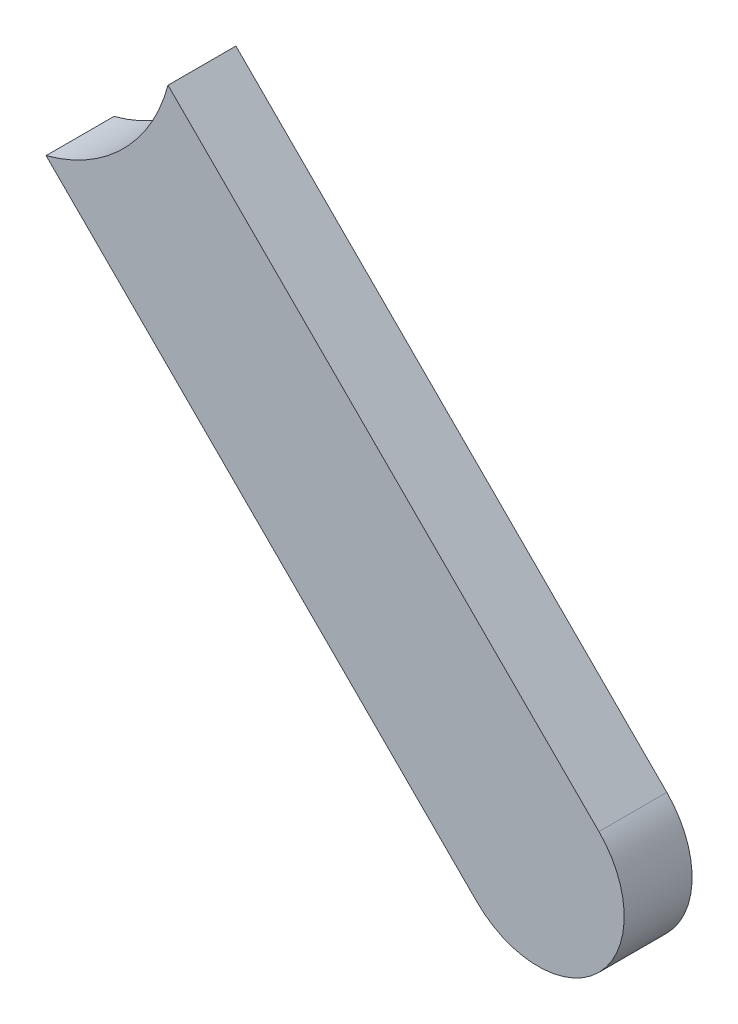
ISO-10303-21;
HEADER;
FILE_DESCRIPTION(('STEP AP214'),'2;1');
FILE_NAME('part.step','',(''),(''),'','','');
FILE_SCHEMA(('AUTOMOTIVE_DESIGN { 1 0 10303 214 1 1 1 1 }'));
ENDSEC;
DATA;
#1=APPLICATION_CONTEXT('core data for automotive mechanical design processes');
#2=APPLICATION_PROTOCOL_DEFINITION('international standard','automotive_design',2000,#1);
#3=PRODUCT_CONTEXT('',#1,'mechanical');
#4=PRODUCT('Part','Part','',(#3));
#5=PRODUCT_RELATED_PRODUCT_CATEGORY('part','',(#4));
#6=PRODUCT_DEFINITION_FORMATION('','',#4);
#7=PRODUCT_DEFINITION_CONTEXT('part definition',#1,'design');
#8=PRODUCT_DEFINITION('design','',#6,#7);
#9=PRODUCT_DEFINITION_SHAPE('','',#8);
#10=(LENGTH_UNIT() NAMED_UNIT(*) SI_UNIT(.MILLI.,.METRE.));
#11=(NAMED_UNIT(*) PLANE_ANGLE_UNIT() SI_UNIT($,.RADIAN.));
#12=(NAMED_UNIT(*) SI_UNIT($,.STERADIAN.) SOLID_ANGLE_UNIT());
#13=UNCERTAINTY_MEASURE_WITH_UNIT(LENGTH_MEASURE(1.E-05),#10,'distance_accuracy_value','');
#14=(GEOMETRIC_REPRESENTATION_CONTEXT(3) GLOBAL_UNCERTAINTY_ASSIGNED_CONTEXT((#13)) GLOBAL_UNIT_ASSIGNED_CONTEXT((#10,
#11,#12)) REPRESENTATION_CONTEXT('',''));
#15=CARTESIAN_POINT('',(0.,0.,0.));
#16=DIRECTION('',(0.,0.,1.));
#17=DIRECTION('',(1.,0.,0.));
#18=AXIS2_PLACEMENT_3D('',#15,#16,#17);
#19=CARTESIAN_POINT('',(90.3014787853028,96.2833093346972,0.));
#20=DIRECTION('',(0.707106781186551,0.707106781186544,0.));
#21=DIRECTION('',(0.707106781186544,-0.707106781186551,0.));
#22=AXIS2_PLACEMENT_3D('',#19,#20,#21);
#23=PLANE('',#22);
#24=DIRECTION('',(0.707106781186544,-0.707106781186551,0.));
#25=VECTOR('',#24,1.);
#26=CARTESIAN_POINT('',(89.99039406,96.59439406,0.1999996));
#27=LINE('',#26,#25);
#28=CARTESIAN_POINT('',(90.3014787853028,96.2833093346972,0.1999996));
#29=VERTEX_POINT('',#28);
#30=CARTESIAN_POINT('',(91.57088366,95.01390446,0.1999996));
#31=VERTEX_POINT('',#30);
#32=EDGE_CURVE('E11',#29,#31,#27,.T.);
#33=ORIENTED_EDGE('',*,*,#32,.F.);
#34=DIRECTION('',(0.,0.,1.));
#35=VECTOR('',#34,1.);
#36=CARTESIAN_POINT('',(90.3014787853028,96.2833093346972,0.));
#37=LINE('',#36,#35);
#38=CARTESIAN_POINT('',(90.3014787853028,96.2833093346972,0.));
#39=VERTEX_POINT('',#38);
#40=EDGE_CURVE('E24',#39,#29,#37,.T.);
#41=ORIENTED_EDGE('',*,*,#40,.F.);
#42=DIRECTION('',(0.707106781186544,-0.707106781186551,0.));
#43=VECTOR('',#42,1.);
#44=CARTESIAN_POINT('',(89.99039406,96.59439406,0.));
#45=LINE('',#44,#43);
#46=CARTESIAN_POINT('',(91.57088366,95.01390446,0.));
#47=VERTEX_POINT('',#46);
#48=EDGE_CURVE('E75',#39,#47,#45,.T.);
#49=ORIENTED_EDGE('',*,*,#48,.T.);
#50=DIRECTION('',(0.,0.,1.));
#51=VECTOR('',#50,1.);
#52=CARTESIAN_POINT('',(91.57088366,95.01390446,0.));
#53=LINE('',#52,#51);
#54=EDGE_CURVE('E37',#47,#31,#53,.T.);
#55=ORIENTED_EDGE('',*,*,#54,.T.);
#56=EDGE_LOOP('',(#33,#41,#49,#55));
#57=FACE_BOUND('',#56,.T.);
#58=ADVANCED_FACE('F17',(#57),#23,.F.);
#59=CARTESIAN_POINT('',(91.7504896,95.1935104,0.));
#60=DIRECTION('',(0.,0.,-1.));
#61=DIRECTION('',(-0.707106781186548,-0.707106781186548,0.));
#62=AXIS2_PLACEMENT_3D('',#59,#60,#61);
#63=CYLINDRICAL_SURFACE('',#62,0.254001156230771);
#64=CARTESIAN_POINT('',(91.7504896,95.1935104,0.1999996));
#65=DIRECTION('',(0.,0.,1.));
#66=DIRECTION('',(-0.707106781186548,-0.707106781186548,0.));
#67=AXIS2_PLACEMENT_3D('',#64,#65,#66);
#68=CIRCLE('',#67,0.254001156230771);
#69=CARTESIAN_POINT('',(91.93009554,95.37311634,0.1999996));
#70=VERTEX_POINT('',#69);
#71=EDGE_CURVE('E83',#31,#70,#68,.T.);
#72=ORIENTED_EDGE('',*,*,#71,.F.);
#73=ORIENTED_EDGE('',*,*,#54,.F.);
#74=CARTESIAN_POINT('',(91.7504896,95.1935104,0.));
#75=DIRECTION('',(0.,0.,1.));
#76=DIRECTION('',(-0.707106781186548,-0.707106781186548,0.));
#77=AXIS2_PLACEMENT_3D('',#74,#75,#76);
#78=CIRCLE('',#77,0.254001156230771);
#79=CARTESIAN_POINT('',(91.93009554,95.37311634,0.));
#80=VERTEX_POINT('',#79);
#81=EDGE_CURVE('E81',#47,#80,#78,.T.);
#82=ORIENTED_EDGE('',*,*,#81,.T.);
#83=DIRECTION('',(0.,0.,1.));
#84=VECTOR('',#83,1.);
#85=CARTESIAN_POINT('',(91.93009554,95.37311634,0.));
#86=LINE('',#85,#84);
#87=EDGE_CURVE('E67',#80,#70,#86,.T.);
#88=ORIENTED_EDGE('',*,*,#87,.T.);
#89=EDGE_LOOP('',(#72,#73,#82,#88));
#90=FACE_BOUND('',#89,.T.);
#91=ADVANCED_FACE('F89',(#90),#63,.T.);
#92=CARTESIAN_POINT('',(91.93009554,95.37311634,0.));
#93=DIRECTION('',(-0.707106781186544,-0.707106781186551,0.));
#94=DIRECTION('',(-0.707106781186551,0.707106781186544,0.));
#95=AXIS2_PLACEMENT_3D('',#92,#93,#94);
#96=PLANE('',#95);
#97=DIRECTION('',(-0.707106781186551,0.707106781186544,0.));
#98=VECTOR('',#97,1.);
#99=CARTESIAN_POINT('',(91.93009554,95.37311634,0.1999996));
#100=LINE('',#99,#98);
#101=CARTESIAN_POINT('',(90.6606906653028,96.6425212146972,0.1999996));
#102=VERTEX_POINT('',#101);
#103=EDGE_CURVE('E71',#70,#102,#100,.T.);
#104=ORIENTED_EDGE('',*,*,#103,.F.);
#105=ORIENTED_EDGE('',*,*,#87,.F.);
#106=DIRECTION('',(-0.707106781186551,0.707106781186544,0.));
#107=VECTOR('',#106,1.);
#108=CARTESIAN_POINT('',(91.93009554,95.37311634,0.));
#109=LINE('',#108,#107);
#110=CARTESIAN_POINT('',(90.6606906653028,96.6425212146972,0.));
#111=VERTEX_POINT('',#110);
#112=EDGE_CURVE('E63',#80,#111,#109,.T.);
#113=ORIENTED_EDGE('',*,*,#112,.T.);
#114=DIRECTION('',(0.,0.,1.));
#115=VECTOR('',#114,1.);
#116=CARTESIAN_POINT('',(90.6606906653028,96.6425212146972,0.));
#117=LINE('',#116,#115);
#118=EDGE_CURVE('E53',#111,#102,#117,.T.);
#119=ORIENTED_EDGE('',*,*,#118,.T.);
#120=EDGE_LOOP('',(#104,#105,#113,#119));
#121=FACE_BOUND('',#120,.T.);
#122=ADVANCED_FACE('F66',(#121),#96,.F.);
#123=CARTESIAN_POINT('',(90.17,96.774,0.));
#124=DIRECTION('',(0.,0.,-1.));
#125=DIRECTION('',(1.,0.,0.));
#126=AXIS2_PLACEMENT_3D('',#123,#124,#125);
#127=CYLINDRICAL_SURFACE('',#126,0.508);
#128=ORIENTED_EDGE('',*,*,#40,.T.);
#129=CARTESIAN_POINT('',(90.17,96.774,0.1999996));
#130=DIRECTION('',(0.,0.,1.));
#131=DIRECTION('',(1.,0.,0.));
#132=AXIS2_PLACEMENT_3D('',#129,#130,#131);
#133=CIRCLE('',#132,0.508);
#134=EDGE_CURVE('E59',#29,#102,#133,.T.);
#135=ORIENTED_EDGE('',*,*,#134,.T.);
#136=ORIENTED_EDGE('',*,*,#118,.F.);
#137=CARTESIAN_POINT('',(90.17,96.774,0.));
#138=DIRECTION('',(0.,0.,1.));
#139=DIRECTION('',(1.,0.,0.));
#140=AXIS2_PLACEMENT_3D('',#137,#138,#139);
#141=CIRCLE('',#140,0.508);
#142=EDGE_CURVE('E57',#39,#111,#141,.T.);
#143=ORIENTED_EDGE('',*,*,#142,.F.);
#144=EDGE_LOOP('',(#128,#135,#136,#143));
#145=FACE_BOUND('',#144,.T.);
#146=ADVANCED_FACE('F55',(#145),#127,.F.);
#147=CARTESIAN_POINT('',(89.99039406,96.59439406,0.));
#148=DIRECTION('',(0.,0.,-1.));
#149=DIRECTION('',(-1.,0.,0.));
#150=AXIS2_PLACEMENT_3D('',#147,#148,#149);
#151=PLANE('',#150);
#152=ORIENTED_EDGE('',*,*,#48,.F.);
#153=ORIENTED_EDGE('',*,*,#142,.T.);
#154=ORIENTED_EDGE('',*,*,#112,.F.);
#155=ORIENTED_EDGE('',*,*,#81,.F.);
#156=EDGE_LOOP('',(#152,#153,#154,#155));
#157=FACE_BOUND('',#156,.T.);
#158=ADVANCED_FACE('F74',(#157),#151,.T.);
#159=CARTESIAN_POINT('',(89.99039406,96.59439406,0.1999996));
#160=DIRECTION('',(0.,0.,-1.));
#161=DIRECTION('',(-1.,0.,0.));
#162=AXIS2_PLACEMENT_3D('',#159,#160,#161);
#163=PLANE('',#162);
#164=ORIENTED_EDGE('',*,*,#134,.F.);
#165=ORIENTED_EDGE('',*,*,#32,.T.);
#166=ORIENTED_EDGE('',*,*,#71,.T.);
#167=ORIENTED_EDGE('',*,*,#103,.T.);
#168=EDGE_LOOP('',(#164,#165,#166,#167));
#169=FACE_BOUND('',#168,.T.);
#170=ADVANCED_FACE('F91',(#169),#163,.F.);
#171=CLOSED_SHELL('',(#58,#91,#122,#146,#158,#170));
#172=MANIFOLD_SOLID_BREP('B1',#171);
#173=ADVANCED_BREP_SHAPE_REPRESENTATION('',(#18,#172),#14);
#174=SHAPE_DEFINITION_REPRESENTATION(#9,#173);
ENDSEC;
END-ISO-10303-21;
